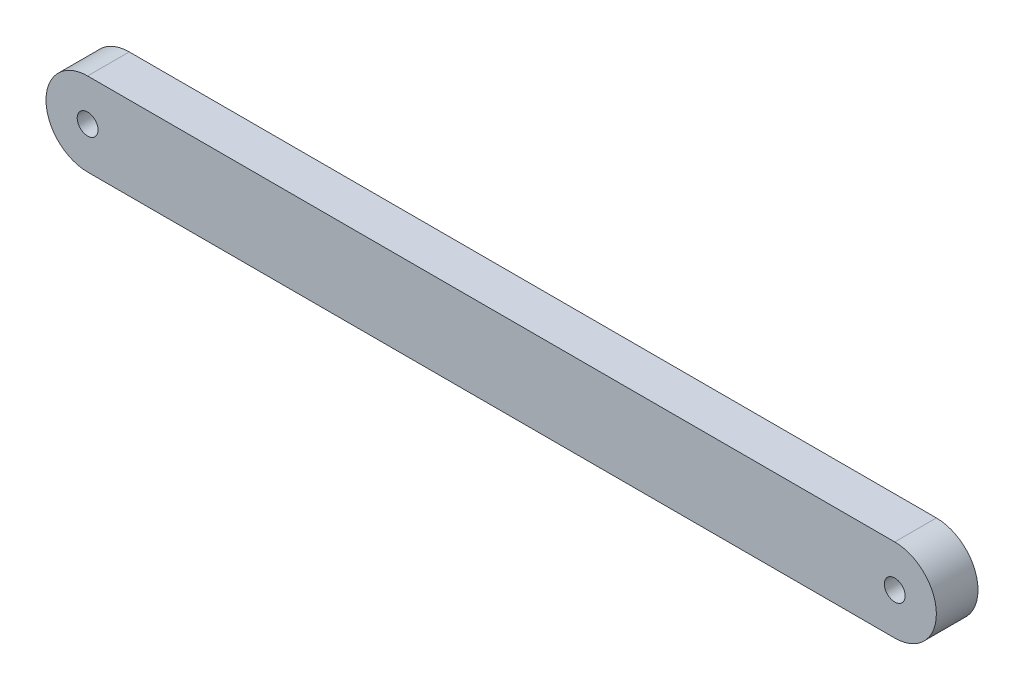
ISO-10303-21;
HEADER;
FILE_DESCRIPTION(('STEP AP214'),'2;1');
FILE_NAME('part.step','',(''),(''),'','','');
FILE_SCHEMA(('AUTOMOTIVE_DESIGN { 1 0 10303 214 1 1 1 1 }'));
ENDSEC;
DATA;
#1=APPLICATION_CONTEXT('core data for automotive mechanical design processes');
#2=APPLICATION_PROTOCOL_DEFINITION('international standard','automotive_design',2000,#1);
#3=PRODUCT_CONTEXT('',#1,'mechanical');
#4=PRODUCT('Part','Part','',(#3));
#5=PRODUCT_RELATED_PRODUCT_CATEGORY('part','',(#4));
#6=PRODUCT_DEFINITION_FORMATION('','',#4);
#7=PRODUCT_DEFINITION_CONTEXT('part definition',#1,'design');
#8=PRODUCT_DEFINITION('design','',#6,#7);
#9=PRODUCT_DEFINITION_SHAPE('','',#8);
#10=(LENGTH_UNIT() NAMED_UNIT(*) SI_UNIT(.MILLI.,.METRE.));
#11=(NAMED_UNIT(*) PLANE_ANGLE_UNIT() SI_UNIT($,.RADIAN.));
#12=(NAMED_UNIT(*) SI_UNIT($,.STERADIAN.) SOLID_ANGLE_UNIT());
#13=UNCERTAINTY_MEASURE_WITH_UNIT(LENGTH_MEASURE(1.E-05),#10,'distance_accuracy_value','');
#14=(GEOMETRIC_REPRESENTATION_CONTEXT(3) GLOBAL_UNCERTAINTY_ASSIGNED_CONTEXT((#13)) GLOBAL_UNIT_ASSIGNED_CONTEXT((#10,
#11,#12)) REPRESENTATION_CONTEXT('',''));
#15=CARTESIAN_POINT('',(0.,0.,0.));
#16=DIRECTION('',(0.,0.,1.));
#17=DIRECTION('',(1.,0.,0.));
#18=AXIS2_PLACEMENT_3D('',#15,#16,#17);
#19=CARTESIAN_POINT('',(48.46675,0.,5.));
#20=DIRECTION('',(0.,0.,-1.));
#21=DIRECTION('',(-1.,0.,0.));
#22=AXIS2_PLACEMENT_3D('',#19,#20,#21);
#23=CYLINDRICAL_SURFACE('',#22,5.);
#24=DIRECTION('',(0.,0.,-1.));
#25=VECTOR('',#24,1.);
#26=CARTESIAN_POINT('',(48.46675,5.,5.));
#27=LINE('',#26,#25);
#28=CARTESIAN_POINT('',(48.46675,5.,5.));
#29=VERTEX_POINT('',#28);
#30=CARTESIAN_POINT('',(48.46675,5.,0.));
#31=VERTEX_POINT('',#30);
#32=EDGE_CURVE('E87',#29,#31,#27,.T.);
#33=ORIENTED_EDGE('',*,*,#32,.F.);
#34=CARTESIAN_POINT('',(48.46675,0.,5.));
#35=DIRECTION('',(0.,0.,1.));
#36=DIRECTION('',(1.,0.,0.));
#37=AXIS2_PLACEMENT_3D('',#34,#35,#36);
#38=CIRCLE('',#37,5.);
#39=CARTESIAN_POINT('',(48.46675,-5.,5.));
#40=VERTEX_POINT('',#39);
#41=EDGE_CURVE('E50',#40,#29,#38,.T.);
#42=ORIENTED_EDGE('',*,*,#41,.F.);
#43=DIRECTION('',(0.,0.,-1.));
#44=VECTOR('',#43,1.);
#45=CARTESIAN_POINT('',(48.46675,-5.,5.));
#46=LINE('',#45,#44);
#47=CARTESIAN_POINT('',(48.46675,-5.,0.));
#48=VERTEX_POINT('',#47);
#49=EDGE_CURVE('E112',#48,#40,#46,.F.);
#50=ORIENTED_EDGE('',*,*,#49,.F.);
#51=CARTESIAN_POINT('',(48.46675,0.,0.));
#52=DIRECTION('',(0.,0.,1.));
#53=DIRECTION('',(1.,0.,0.));
#54=AXIS2_PLACEMENT_3D('',#51,#52,#53);
#55=CIRCLE('',#54,5.);
#56=EDGE_CURVE('E11',#31,#48,#55,.F.);
#57=ORIENTED_EDGE('',*,*,#56,.F.);
#58=EDGE_LOOP('',(#33,#42,#50,#57));
#59=FACE_BOUND('',#58,.T.);
#60=ADVANCED_FACE('F41',(#59),#23,.T.);
#61=CARTESIAN_POINT('',(-48.46675,0.,0.));
#62=DIRECTION('',(0.,0.,-1.));
#63=DIRECTION('',(-1.,0.,0.));
#64=AXIS2_PLACEMENT_3D('',#61,#62,#63);
#65=CYLINDRICAL_SURFACE('',#64,5.);
#66=DIRECTION('',(0.,0.,-1.));
#67=VECTOR('',#66,1.);
#68=CARTESIAN_POINT('',(-48.46675,5.,5.));
#69=LINE('',#68,#67);
#70=CARTESIAN_POINT('',(-48.46675,5.,0.));
#71=VERTEX_POINT('',#70);
#72=CARTESIAN_POINT('',(-48.46675,5.,5.));
#73=VERTEX_POINT('',#72);
#74=EDGE_CURVE('E86',#71,#73,#69,.F.);
#75=ORIENTED_EDGE('',*,*,#74,.F.);
#76=CARTESIAN_POINT('',(-48.46675,0.,0.));
#77=DIRECTION('',(0.,0.,1.));
#78=DIRECTION('',(1.,0.,0.));
#79=AXIS2_PLACEMENT_3D('',#76,#77,#78);
#80=CIRCLE('',#79,5.);
#81=CARTESIAN_POINT('',(-48.46675,-5.,0.));
#82=VERTEX_POINT('',#81);
#83=EDGE_CURVE('E91',#82,#71,#80,.F.);
#84=ORIENTED_EDGE('',*,*,#83,.F.);
#85=DIRECTION('',(0.,0.,-1.));
#86=VECTOR('',#85,1.);
#87=CARTESIAN_POINT('',(-48.46675,-5.,5.));
#88=LINE('',#87,#86);
#89=CARTESIAN_POINT('',(-48.46675,-5.,5.));
#90=VERTEX_POINT('',#89);
#91=EDGE_CURVE('E98',#90,#82,#88,.T.);
#92=ORIENTED_EDGE('',*,*,#91,.F.);
#93=CARTESIAN_POINT('',(-48.46675,0.,5.));
#94=DIRECTION('',(0.,0.,1.));
#95=DIRECTION('',(1.,0.,0.));
#96=AXIS2_PLACEMENT_3D('',#93,#94,#95);
#97=CIRCLE('',#96,5.);
#98=EDGE_CURVE('E97',#73,#90,#97,.T.);
#99=ORIENTED_EDGE('',*,*,#98,.F.);
#100=EDGE_LOOP('',(#75,#84,#92,#99));
#101=FACE_BOUND('',#100,.T.);
#102=ADVANCED_FACE('F101',(#101),#65,.T.);
#103=CARTESIAN_POINT('',(-53.46675,5.,5.));
#104=DIRECTION('',(0.,-1.,0.));
#105=DIRECTION('',(0.,0.,-1.));
#106=AXIS2_PLACEMENT_3D('',#103,#104,#105);
#107=PLANE('',#106);
#108=DIRECTION('',(-1.,0.,0.));
#109=VECTOR('',#108,1.);
#110=CARTESIAN_POINT('',(-53.46675,5.,5.));
#111=LINE('',#110,#109);
#112=EDGE_CURVE('E106',#29,#73,#111,.T.);
#113=ORIENTED_EDGE('',*,*,#112,.F.);
#114=ORIENTED_EDGE('',*,*,#32,.T.);
#115=DIRECTION('',(-1.,0.,0.));
#116=VECTOR('',#115,1.);
#117=CARTESIAN_POINT('',(-53.46675,5.,0.));
#118=LINE('',#117,#116);
#119=EDGE_CURVE('E81',#31,#71,#118,.T.);
#120=ORIENTED_EDGE('',*,*,#119,.T.);
#121=ORIENTED_EDGE('',*,*,#74,.T.);
#122=EDGE_LOOP('',(#113,#114,#120,#121));
#123=FACE_BOUND('',#122,.T.);
#124=ADVANCED_FACE('F84',(#123),#107,.F.);
#125=CARTESIAN_POINT('',(-53.46675,-5.,5.));
#126=DIRECTION('',(0.,1.,0.));
#127=DIRECTION('',(0.,0.,1.));
#128=AXIS2_PLACEMENT_3D('',#125,#126,#127);
#129=PLANE('',#128);
#130=DIRECTION('',(1.,0.,0.));
#131=VECTOR('',#130,1.);
#132=CARTESIAN_POINT('',(-53.46675,-5.,0.));
#133=LINE('',#132,#131);
#134=EDGE_CURVE('E88',#82,#48,#133,.T.);
#135=ORIENTED_EDGE('',*,*,#134,.T.);
#136=ORIENTED_EDGE('',*,*,#49,.T.);
#137=DIRECTION('',(1.,0.,0.));
#138=VECTOR('',#137,1.);
#139=CARTESIAN_POINT('',(-53.46675,-5.,5.));
#140=LINE('',#139,#138);
#141=EDGE_CURVE('E102',#90,#40,#140,.T.);
#142=ORIENTED_EDGE('',*,*,#141,.F.);
#143=ORIENTED_EDGE('',*,*,#91,.T.);
#144=EDGE_LOOP('',(#135,#136,#142,#143));
#145=FACE_BOUND('',#144,.T.);
#146=ADVANCED_FACE('F149',(#145),#129,.F.);
#147=CARTESIAN_POINT('',(0.,0.,5.));
#148=DIRECTION('',(0.,0.,1.));
#149=DIRECTION('',(1.,0.,0.));
#150=AXIS2_PLACEMENT_3D('',#147,#148,#149);
#151=PLANE('',#150);
#152=CARTESIAN_POINT('',(-48.46675,0.,5.));
#153=DIRECTION('',(0.,0.,1.));
#154=DIRECTION('',(1.,0.,0.));
#155=AXIS2_PLACEMENT_3D('',#152,#153,#154);
#156=CIRCLE('',#155,1.24999999999999);
#157=CARTESIAN_POINT('',(-47.21675,0.,5.));
#158=VERTEX_POINT('',#157);
#159=EDGE_CURVE('E124',#158,#158,#156,.T.);
#160=ORIENTED_EDGE('',*,*,#159,.F.);
#161=EDGE_LOOP('',(#160));
#162=FACE_BOUND('',#161,.T.);
#163=CARTESIAN_POINT('',(48.46675,0.,5.));
#164=DIRECTION('',(0.,0.,1.));
#165=DIRECTION('',(1.,0.,0.));
#166=AXIS2_PLACEMENT_3D('',#163,#164,#165);
#167=CIRCLE('',#166,1.24999999999999);
#168=CARTESIAN_POINT('',(49.71675,0.,5.));
#169=VERTEX_POINT('',#168);
#170=EDGE_CURVE('E121',#169,#169,#167,.T.);
#171=ORIENTED_EDGE('',*,*,#170,.F.);
#172=EDGE_LOOP('',(#171));
#173=FACE_BOUND('',#172,.T.);
#174=ORIENTED_EDGE('',*,*,#141,.T.);
#175=ORIENTED_EDGE('',*,*,#41,.T.);
#176=ORIENTED_EDGE('',*,*,#112,.T.);
#177=ORIENTED_EDGE('',*,*,#98,.T.);
#178=EDGE_LOOP('',(#174,#175,#176,#177));
#179=FACE_BOUND('',#178,.T.);
#180=ADVANCED_FACE('F115',(#162,#173,#179),#151,.T.);
#181=CARTESIAN_POINT('',(0.,0.,0.));
#182=DIRECTION('',(0.,0.,1.));
#183=DIRECTION('',(1.,0.,0.));
#184=AXIS2_PLACEMENT_3D('',#181,#182,#183);
#185=PLANE('',#184);
#186=CARTESIAN_POINT('',(-48.46675,0.,0.));
#187=DIRECTION('',(0.,0.,1.));
#188=DIRECTION('',(1.,0.,0.));
#189=AXIS2_PLACEMENT_3D('',#186,#187,#188);
#190=CIRCLE('',#189,1.24999999999999);
#191=CARTESIAN_POINT('',(-47.21675,0.,0.));
#192=VERTEX_POINT('',#191);
#193=EDGE_CURVE('E45',#192,#192,#190,.T.);
#194=ORIENTED_EDGE('',*,*,#193,.T.);
#195=EDGE_LOOP('',(#194));
#196=FACE_BOUND('',#195,.T.);
#197=CARTESIAN_POINT('',(48.46675,0.,0.));
#198=DIRECTION('',(0.,0.,1.));
#199=DIRECTION('',(1.,0.,0.));
#200=AXIS2_PLACEMENT_3D('',#197,#198,#199);
#201=CIRCLE('',#200,1.24999999999999);
#202=CARTESIAN_POINT('',(49.71675,0.,0.));
#203=VERTEX_POINT('',#202);
#204=EDGE_CURVE('E89',#203,#203,#201,.T.);
#205=ORIENTED_EDGE('',*,*,#204,.T.);
#206=EDGE_LOOP('',(#205));
#207=FACE_BOUND('',#206,.T.);
#208=ORIENTED_EDGE('',*,*,#119,.F.);
#209=ORIENTED_EDGE('',*,*,#56,.T.);
#210=ORIENTED_EDGE('',*,*,#134,.F.);
#211=ORIENTED_EDGE('',*,*,#83,.T.);
#212=EDGE_LOOP('',(#208,#209,#210,#211));
#213=FACE_BOUND('',#212,.T.);
#214=ADVANCED_FACE('F92',(#196,#207,#213),#185,.F.);
#215=CARTESIAN_POINT('',(48.46675,0.,5.));
#216=DIRECTION('',(0.,0.,1.));
#217=DIRECTION('',(1.,0.,0.));
#218=AXIS2_PLACEMENT_3D('',#215,#216,#217);
#219=CYLINDRICAL_SURFACE('',#218,1.24999999999999);
#220=ORIENTED_EDGE('',*,*,#170,.T.);
#221=EDGE_LOOP('',(#220));
#222=FACE_BOUND('',#221,.T.);
#223=ORIENTED_EDGE('',*,*,#204,.F.);
#224=EDGE_LOOP('',(#223));
#225=FACE_BOUND('',#224,.T.);
#226=ADVANCED_FACE('F135',(#222,#225),#219,.F.);
#227=CARTESIAN_POINT('',(-48.46675,0.,5.));
#228=DIRECTION('',(0.,0.,1.));
#229=DIRECTION('',(1.,0.,0.));
#230=AXIS2_PLACEMENT_3D('',#227,#228,#229);
#231=CYLINDRICAL_SURFACE('',#230,1.24999999999999);
#232=ORIENTED_EDGE('',*,*,#159,.T.);
#233=EDGE_LOOP('',(#232));
#234=FACE_BOUND('',#233,.T.);
#235=ORIENTED_EDGE('',*,*,#193,.F.);
#236=EDGE_LOOP('',(#235));
#237=FACE_BOUND('',#236,.T.);
#238=ADVANCED_FACE('F133',(#234,#237),#231,.F.);
#239=CLOSED_SHELL('',(#60,#102,#124,#146,#180,#214,#226,#238));
#240=MANIFOLD_SOLID_BREP('B2',#239);
#241=ADVANCED_BREP_SHAPE_REPRESENTATION('',(#18,#240),#14);
#242=SHAPE_DEFINITION_REPRESENTATION(#9,#241);
ENDSEC;
END-ISO-10303-21;
